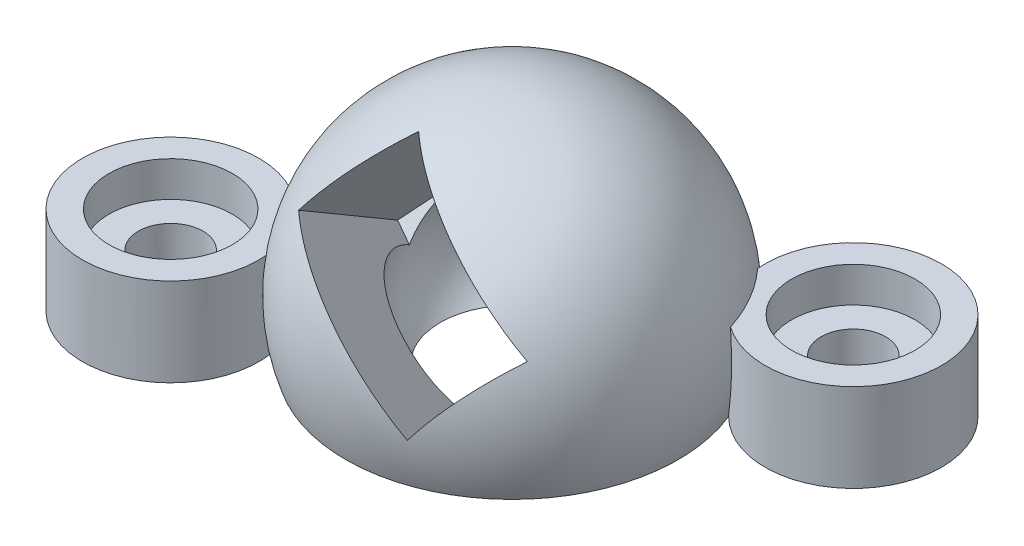
ISO-10303-21;
HEADER;
FILE_DESCRIPTION(('STEP AP214'),'2;1');
FILE_NAME('part.step','',(''),(''),'','','');
FILE_SCHEMA(('AUTOMOTIVE_DESIGN { 1 0 10303 214 1 1 1 1 }'));
ENDSEC;
DATA;
#1=APPLICATION_CONTEXT('core data for automotive mechanical design processes');
#2=APPLICATION_PROTOCOL_DEFINITION('international standard','automotive_design',2000,#1);
#3=PRODUCT_CONTEXT('',#1,'mechanical');
#4=PRODUCT('Part','Part','',(#3));
#5=PRODUCT_RELATED_PRODUCT_CATEGORY('part','',(#4));
#6=PRODUCT_DEFINITION_FORMATION('','',#4);
#7=PRODUCT_DEFINITION_CONTEXT('part definition',#1,'design');
#8=PRODUCT_DEFINITION('design','',#6,#7);
#9=PRODUCT_DEFINITION_SHAPE('','',#8);
#10=(LENGTH_UNIT() NAMED_UNIT(*) SI_UNIT(.MILLI.,.METRE.));
#11=(NAMED_UNIT(*) PLANE_ANGLE_UNIT() SI_UNIT($,.RADIAN.));
#12=(NAMED_UNIT(*) SI_UNIT($,.STERADIAN.) SOLID_ANGLE_UNIT());
#13=UNCERTAINTY_MEASURE_WITH_UNIT(LENGTH_MEASURE(1.E-05),#10,'distance_accuracy_value','');
#14=(GEOMETRIC_REPRESENTATION_CONTEXT(3) GLOBAL_UNCERTAINTY_ASSIGNED_CONTEXT((#13)) GLOBAL_UNIT_ASSIGNED_CONTEXT((#10,
#11,#12)) REPRESENTATION_CONTEXT('',''));
#15=CARTESIAN_POINT('',(0.,0.,0.));
#16=DIRECTION('',(0.,0.,1.));
#17=DIRECTION('',(1.,0.,0.));
#18=AXIS2_PLACEMENT_3D('',#15,#16,#17);
#19=CARTESIAN_POINT('',(-71.2916512459885,73.,-25.9807621135332));
#20=DIRECTION('',(0.,1.,0.));
#21=DIRECTION('',(0.5,0.,0.866025403784439));
#22=AXIS2_PLACEMENT_3D('',#19,#20,#21);
#23=SPHERICAL_SURFACE('',#22,5.99999999999999);
#24=CARTESIAN_POINT('',(-71.2916512459885,71.,-25.9807621135332));
#25=DIRECTION('',(0.,-1.,0.));
#26=DIRECTION('',(0.,0.,-1.));
#27=AXIS2_PLACEMENT_3D('',#24,#25,#26);
#28=CIRCLE('',#27,5.65685424949238);
#29=CARTESIAN_POINT('',(-76.5335077636322,71.,-23.8540415751369));
#30=VERTEX_POINT('',#29);
#31=CARTESIAN_POINT('',(-66.8289289741654,71.,-29.4569827516075));
#32=VERTEX_POINT('',#31);
#33=EDGE_CURVE('E237',#30,#32,#28,.T.);
#34=ORIENTED_EDGE('',*,*,#33,.F.);
#35=CARTESIAN_POINT('',(-76.9288621112924,74.0002,-24.1859212793364));
#36=CARTESIAN_POINT('',(-76.9404096114301,73.9496620404665,-24.1940265280293));
#37=CARTESIAN_POINT('',(-76.9510396694773,73.8988041487702,-24.2013730447985));
#38=CARTESIAN_POINT('',(-76.9704792720344,73.7965686087353,-24.2146527744234));
#39=CARTESIAN_POINT('',(-76.9792891798448,73.7451910662703,-24.2205862693533));
#40=CARTESIAN_POINT('',(-77.0030075724958,73.5904873630535,-24.236421748871));
#41=CARTESIAN_POINT('',(-77.0152178517531,73.4865322631475,-24.2443677264348));
#42=CARTESIAN_POINT('',(-77.032681173534,73.2757451332539,-24.2556591452825));
#43=CARTESIAN_POINT('',(-77.0377924095279,73.1688967733631,-24.2589108654573));
#44=CARTESIAN_POINT('',(-77.0406427281053,72.9550449188531,-24.2607295873572));
#45=CARTESIAN_POINT('',(-77.0383807974859,72.8480414049326,-24.259295945231));
#46=CARTESIAN_POINT('',(-77.0264789882416,72.6348501805666,-24.2516571619921));
#47=CARTESIAN_POINT('',(-77.0168554860158,72.52866118703,-24.2454626117526));
#48=CARTESIAN_POINT('',(-76.9901860137667,72.3176550384306,-24.2279101209463));
#49=CARTESIAN_POINT('',(-76.9731413656155,72.2128376424789,-24.2165530999151));
#50=CARTESIAN_POINT('',(-76.9317331083372,72.0065978326292,-24.1880624752238));
#51=CARTESIAN_POINT('',(-76.9074485787039,71.9051512731432,-24.1709910529886));
#52=CARTESIAN_POINT('',(-76.8513847973874,71.7058549967528,-24.129902290681));
#53=CARTESIAN_POINT('',(-76.8196121769803,71.6080021854261,-24.1058910920759));
#54=CARTESIAN_POINT('',(-76.7495424127959,71.4206435124871,-24.0500950992091));
#55=CARTESIAN_POINT('',(-76.7114866773368,71.3309707282417,-24.0185837436535));
#56=CARTESIAN_POINT('',(-76.6489292568986,71.2020077467898,-23.9634749391562));
#57=CARTESIAN_POINT('',(-76.6270691653911,71.1597920463395,-23.9437064995161));
#58=CARTESIAN_POINT('',(-76.58155328353,71.0778030739371,-23.9011582338771));
#59=CARTESIAN_POINT('',(-76.55789405521,71.0380347549418,-23.8783725774296));
#60=CARTESIAN_POINT('',(-76.5333795030156,70.9997999999986,-23.8539135435857));
#61=B_SPLINE_CURVE_WITH_KNOTS('',3,(#35,#36,#37,#38,#39,#40,#41,#42,#43,#44,#45,#46,#47,#48,#49,
#50,#51,#52,#53,#54,#55,#56,#57,#58,#59,#60),.UNSPECIFIED.,.F.,.F.,(4,2,2,2,2,2,2,2,2,2,2,2,4),
(0.,0.157377048485897,0.314722654217877,0.629234458382303,0.949942579700665,1.27069477382301,
1.5907354969119,1.91071923689573,2.22732850930363,2.54365844666381,2.84986255835412,
3.00416307873573,3.15876624238508),.UNSPECIFIED.);
#62=CARTESIAN_POINT('',(-76.9289078099031,74.,-24.1859533681225));
#63=VERTEX_POINT('',#62);
#64=EDGE_CURVE('E223',#63,#30,#61,.T.);
#65=ORIENTED_EDGE('',*,*,#64,.F.);
#66=CARTESIAN_POINT('',(-71.2916512459885,74.,-25.9807621135332));
#67=DIRECTION('',(0.,-1.,0.));
#68=DIRECTION('',(0.,0.,-1.));
#69=AXIS2_PLACEMENT_3D('',#66,#67,#68);
#70=CIRCLE('',#69,5.91607978309961);
#71=CARTESIAN_POINT('',(-75.6646294964059,74.,-21.9961590942379));
#72=VERTEX_POINT('',#71);
#73=EDGE_CURVE('E245',#63,#72,#70,.F.);
#74=ORIENTED_EDGE('',*,*,#73,.T.);
#75=CARTESIAN_POINT('',(-75.7544202660812,70.9998000000002,-22.5047165681897));
#76=CARTESIAN_POINT('',(-75.7478610713158,71.0278724460281,-22.480141831029));
#77=CARTESIAN_POINT('',(-75.741857082309,71.0567865660781,-22.4564149029977));
#78=CARTESIAN_POINT('',(-75.7308218750301,71.1160434934823,-22.4106215828581));
#79=CARTESIAN_POINT('',(-75.7257898790342,71.1463851342514,-22.3885538718634));
#80=CARTESIAN_POINT('',(-75.7119680996226,71.2389943886753,-22.3248986796105));
#81=CARTESIAN_POINT('',(-75.7044028245519,71.3030725103163,-22.2856652917006));
#82=CARTESIAN_POINT('',(-75.6917327364516,71.4339893832939,-22.2134726758537));
#83=CARTESIAN_POINT('',(-75.6866038828535,71.5007937830545,-22.1804541722372));
#84=CARTESIAN_POINT('',(-75.6780360064624,71.6369688871943,-22.1197574394365));
#85=CARTESIAN_POINT('',(-75.6745990667091,71.7063426425283,-22.0920858185161));
#86=CARTESIAN_POINT('',(-75.6680470503794,71.8687142272827,-22.0340006768176));
#87=CARTESIAN_POINT('',(-75.6653613066737,71.9623745047608,-22.0053920932579));
#88=CARTESIAN_POINT('',(-75.6612508589966,72.1518627703872,-21.9562299517404));
#89=CARTESIAN_POINT('',(-75.6598272078145,72.2476925000112,-21.9356831265414));
#90=CARTESIAN_POINT('',(-75.6577195968348,72.4413341169988,-21.9021519441187));
#91=CARTESIAN_POINT('',(-75.6570407221433,72.5391550423467,-21.8892198519956));
#92=CARTESIAN_POINT('',(-75.6561275724576,72.7354433347077,-21.8708876949954));
#93=CARTESIAN_POINT('',(-75.6558930572532,72.8339103235682,-21.8654835611013));
#94=CARTESIAN_POINT('',(-75.6557488701633,73.0229211548649,-21.8622287844167));
#95=CARTESIAN_POINT('',(-75.6558142405219,73.1134555342488,-21.863797479396));
#96=CARTESIAN_POINT('',(-75.6562479438936,73.294177518352,-21.8732152392726));
#97=CARTESIAN_POINT('',(-75.6566162051309,73.3843652001414,-21.8810628162579));
#98=CARTESIAN_POINT('',(-75.6577954010961,73.5629332316184,-21.9030314673953));
#99=CARTESIAN_POINT('',(-75.6586012267414,73.6513224558665,-21.9170797928769));
#100=CARTESIAN_POINT('',(-75.660970058192,73.8268475917444,-21.9516933011054));
#101=CARTESIAN_POINT('',(-75.6625334535248,73.9139828348421,-21.9722618345323));
#102=CARTESIAN_POINT('',(-75.6646344368045,74.0002,-21.9962147147887));
#103=B_SPLINE_CURVE_WITH_KNOTS('',3,(#75,#76,#77,#78,#79,#80,#81,#82,#83,#84,#85,#86,#87,#88,
#89,#90,#91,#92,#93,#94,#95,#96,#97,#98,#99,#100,#101,#102),.UNSPECIFIED.,.F.,.F.,(4,2,2,2,2,2,
2,2,2,2,2,2,2,4),(0.,0.113585797209057,0.227080330731909,0.453169231823033,0.67697839353544,
0.901062418300023,1.19454534747423,1.48827285917174,1.78399360635981,2.07955444826517,
2.35098507155577,2.62235139274873,2.89061526718655,3.15901722427214),.UNSPECIFIED.);
#104=CARTESIAN_POINT('',(-75.7543735178116,71.,-22.5045414754588));
#105=VERTEX_POINT('',#104);
#106=EDGE_CURVE('E233',#105,#72,#103,.T.);
#107=ORIENTED_EDGE('',*,*,#106,.F.);
#108=CARTESIAN_POINT('',(-66.0497947283448,71.,-28.1074826519294));
#109=VERTEX_POINT('',#108);
#110=EDGE_CURVE('E238',#109,#105,#28,.T.);
#111=ORIENTED_EDGE('',*,*,#110,.F.);
#112=CARTESIAN_POINT('',(-65.6544403806847,74.0002,-27.7756029477299));
#113=CARTESIAN_POINT('',(-65.642892880547,73.9496620404665,-27.7674976990371));
#114=CARTESIAN_POINT('',(-65.6322628224998,73.8988041487702,-27.7601511822679));
#115=CARTESIAN_POINT('',(-65.6128232199427,73.7965686087353,-27.746871452643));
#116=CARTESIAN_POINT('',(-65.6040133121323,73.7451910662704,-27.740937957713));
#117=CARTESIAN_POINT('',(-65.5802949194813,73.5904873630535,-27.7251024781954));
#118=CARTESIAN_POINT('',(-65.568084640224,73.4865322631475,-27.7171565006315));
#119=CARTESIAN_POINT('',(-65.550621318443,73.275745133254,-27.7058650817838));
#120=CARTESIAN_POINT('',(-65.5455100824492,73.1688967733632,-27.702613361609));
#121=CARTESIAN_POINT('',(-65.5426597638718,72.9550449188532,-27.7007946397091));
#122=CARTESIAN_POINT('',(-65.5449216944912,72.8480414049327,-27.7022282818354));
#123=CARTESIAN_POINT('',(-65.5568235037355,72.6348501805667,-27.7098670650743));
#124=CARTESIAN_POINT('',(-65.5664470059613,72.5286611870301,-27.7160616153137));
#125=CARTESIAN_POINT('',(-65.5931164782104,72.3176550384307,-27.73361410612));
#126=CARTESIAN_POINT('',(-65.6101611263616,72.212837642479,-27.7449711271512));
#127=CARTESIAN_POINT('',(-65.6515693836399,72.0065978326293,-27.7734617518426));
#128=CARTESIAN_POINT('',(-65.6758539132732,71.9051512731433,-27.7905331740777));
#129=CARTESIAN_POINT('',(-65.7319176945896,71.7058549967529,-27.8316219363854));
#130=CARTESIAN_POINT('',(-65.7636903149968,71.6080021854263,-27.8556331349905));
#131=CARTESIAN_POINT('',(-65.8337600791811,71.4206435124872,-27.9114291278573));
#132=CARTESIAN_POINT('',(-65.8718158146403,71.3309707282418,-27.9429404834129));
#133=CARTESIAN_POINT('',(-65.9343732350786,71.2020077467898,-27.9980492879102));
#134=CARTESIAN_POINT('',(-65.956233326586,71.1597920463395,-28.0178177275503));
#135=CARTESIAN_POINT('',(-66.0017492084471,71.0778030739371,-28.0603659931893));
#136=CARTESIAN_POINT('',(-66.0254084367672,71.0380347549418,-28.0831516496368));
#137=CARTESIAN_POINT('',(-66.0499229889615,70.9997999999986,-28.1076106834807));
#138=B_SPLINE_CURVE_WITH_KNOTS('',3,(#112,#113,#114,#115,#116,#117,#118,#119,#120,#121,#122,
#123,#124,#125,#126,#127,#128,#129,#130,#131,#132,#133,#134,#135,#136,#137),.UNSPECIFIED.,.F.,
.F.,(4,2,2,2,2,2,2,2,2,2,2,2,4),(0.,0.157377048485897,0.314722654217848,0.629234458382262,
0.949942579700582,1.27069477382293,1.59073549691181,1.91071923689562,2.22732850930349,
2.54365844666364,2.84986255835406,3.00416307873573,3.15876624238513),.UNSPECIFIED.);
#139=CARTESIAN_POINT('',(-65.654394682074,74.,-27.7755708589438));
#140=VERTEX_POINT('',#139);
#141=EDGE_CURVE('E190',#140,#109,#138,.T.);
#142=ORIENTED_EDGE('',*,*,#141,.F.);
#143=CARTESIAN_POINT('',(-71.2916512459885,74.,-25.9807621135332));
#144=DIRECTION('',(0.,-1.,0.));
#145=DIRECTION('',(0.,0.,-1.));
#146=AXIS2_PLACEMENT_3D('',#143,#144,#145);
#147=CIRCLE('',#146,5.91607978309961);
#148=CARTESIAN_POINT('',(-66.9186729955711,74.,-29.9653651328283));
#149=VERTEX_POINT('',#148);
#150=EDGE_CURVE('E244',#140,#149,#147,.F.);
#151=ORIENTED_EDGE('',*,*,#150,.T.);
#152=CARTESIAN_POINT('',(-66.8288822258958,70.9998000000002,-29.4568076588764));
#153=CARTESIAN_POINT('',(-66.8354414206612,71.0278724460281,-29.4813823960372));
#154=CARTESIAN_POINT('',(-66.841445409668,71.0567865660781,-29.5051093240685));
#155=CARTESIAN_POINT('',(-66.8524806169469,71.1160434934823,-29.550902644208));
#156=CARTESIAN_POINT('',(-66.8575126129428,71.1463851342514,-29.5729703552028));
#157=CARTESIAN_POINT('',(-66.8713343923544,71.2389943886752,-29.6366255474556));
#158=CARTESIAN_POINT('',(-66.8788996674251,71.3030725103162,-29.6758589353656));
#159=CARTESIAN_POINT('',(-66.8915697555255,71.4339893832938,-29.7480515512125));
#160=CARTESIAN_POINT('',(-66.8966986091235,71.5007937830544,-29.781070054829));
#161=CARTESIAN_POINT('',(-66.9052664855146,71.6369688871942,-29.8417667876296));
#162=CARTESIAN_POINT('',(-66.9087034252679,71.7063426425282,-29.8694384085501));
#163=CARTESIAN_POINT('',(-66.9152554415977,71.8687142272826,-29.9275235502486));
#164=CARTESIAN_POINT('',(-66.9179411853033,71.9623745047606,-29.9561321338083));
#165=CARTESIAN_POINT('',(-66.9220516329804,72.151862770387,-30.0052942753258));
#166=CARTESIAN_POINT('',(-66.9234752841625,72.2476925000111,-30.0258411005248));
#167=CARTESIAN_POINT('',(-66.9255828951422,72.4413341169986,-30.0593722829475));
#168=CARTESIAN_POINT('',(-66.9262617698337,72.5391550423465,-30.0723043750706));
#169=CARTESIAN_POINT('',(-66.9271749195194,72.7354433347075,-30.0906365320708));
#170=CARTESIAN_POINT('',(-66.9274094347238,72.8339103235679,-30.0960406659649));
#171=CARTESIAN_POINT('',(-66.9275536218137,73.0229211548647,-30.0992954426495));
#172=CARTESIAN_POINT('',(-66.9274882514551,73.1134555342486,-30.0977267476702));
#173=CARTESIAN_POINT('',(-66.9270545480834,73.2941775183518,-30.0883089877937));
#174=CARTESIAN_POINT('',(-66.9266862868461,73.3843652001413,-30.0804614108083));
#175=CARTESIAN_POINT('',(-66.925507090881,73.5629332316183,-30.058492759671));
#176=CARTESIAN_POINT('',(-66.9247012652356,73.6513224558665,-30.0444444341893));
#177=CARTESIAN_POINT('',(-66.922332433785,73.8268475917444,-30.0098309259609));
#178=CARTESIAN_POINT('',(-66.9207690384522,73.9139828348421,-29.9892623925339));
#179=CARTESIAN_POINT('',(-66.9186680551725,74.0002,-29.9653095122775));
#180=B_SPLINE_CURVE_WITH_KNOTS('',3,(#152,#153,#154,#155,#156,#157,#158,#159,#160,#161,#162,
#163,#164,#165,#166,#167,#168,#169,#170,#171,#172,#173,#174,#175,#176,#177,#178,#179),
.UNSPECIFIED.,.F.,.F.,(4,2,2,2,2,2,2,2,2,2,2,2,2,4),(0.,0.113585797209044,0.227080330731855,
0.453169231822974,0.676978393535343,0.901062418299918,1.19454534747411,1.48827285917158,
1.78399360635961,2.07955444826494,2.35098507155562,2.62235139274863,2.89061526718653,
3.15901722427217),.UNSPECIFIED.);
#181=EDGE_CURVE('E200',#32,#149,#180,.T.);
#182=ORIENTED_EDGE('',*,*,#181,.F.);
#183=EDGE_LOOP('',(#34,#65,#74,#107,#111,#142,#151,#182));
#184=FACE_BOUND('',#183,.T.);
#185=CARTESIAN_POINT('',(-72.3829899580333,71.7684504931306,-25.0308854753731));
#186=DIRECTION('',(-0.57438879581302,-0.648183950983877,0.499935072715847));
#187=DIRECTION('',(0.748425964464047,-0.663218346938669,0.));
#188=AXIS2_PLACEMENT_3D('',#185,#186,#187);
#189=CIRCLE('',#188,5.69122131005288);
#190=CARTESIAN_POINT('',(-74.4159921177242,76.0254293010476,-21.847328714824));
#191=VERTEX_POINT('',#190);
#192=CARTESIAN_POINT('',(-69.2324587112696,72.5784404179814,-20.3609744285965));
#193=VERTEX_POINT('',#192);
#194=EDGE_CURVE('E161',#191,#193,#189,.F.);
#195=ORIENTED_EDGE('',*,*,#194,.F.);
#196=CARTESIAN_POINT('',(-73.8834179492158,74.7234944415331,-26.7239392566469));
#197=DIRECTION('',(-0.80992709475853,0.538592012979103,-0.232242857223047));
#198=DIRECTION('',(-0.55373225411861,-0.832694776462975,0.));
#199=AXIS2_PLACEMENT_3D('',#196,#197,#198);
#200=CIRCLE('',#199,5.07543101617981);
#201=CARTESIAN_POINT('',(-72.2333146936347,78.4885283147864,-23.7470819911442));
#202=VERTEX_POINT('',#201);
#203=EDGE_CURVE('E11',#202,#191,#200,.F.);
#204=ORIENTED_EDGE('',*,*,#203,.F.);
#205=CARTESIAN_POINT('',(-70.2003125339438,74.2315495068694,-26.9306387516933));
#206=DIRECTION('',(0.574388795813023,0.648183950983875,-0.499935072715846));
#207=DIRECTION('',(-0.748425964464045,0.663218346938672,0.));
#208=AXIS2_PLACEMENT_3D('',#205,#206,#207);
#209=CIRCLE('',#208,5.69122131005286);
#210=CARTESIAN_POINT('',(-67.0497812871801,75.0415394317201,-22.2607277049167));
#211=VERTEX_POINT('',#210);
#212=EDGE_CURVE('E158',#211,#202,#209,.F.);
#213=ORIENTED_EDGE('',*,*,#212,.F.);
#214=CARTESIAN_POINT('',(-68.6998845427612,71.2765055584669,-25.2375849704194));
#215=DIRECTION('',(0.809927094758531,-0.538592012979103,0.232242857223047));
#216=DIRECTION('',(0.553732254118609,0.832694776462975,0.));
#217=AXIS2_PLACEMENT_3D('',#214,#215,#216);
#218=CIRCLE('',#217,5.07543101617979);
#219=EDGE_CURVE('E164',#193,#211,#218,.F.);
#220=ORIENTED_EDGE('',*,*,#219,.F.);
#221=EDGE_LOOP('',(#195,#204,#213,#220));
#222=FACE_BOUND('',#221,.T.);
#223=ADVANCED_FACE('F41',(#184,#222),#23,.T.);
#224=CARTESIAN_POINT('',(-74.1200783707347,71.,-30.8797415990995));
#225=DIRECTION('',(0.,-1.,0.));
#226=DIRECTION('',(0.,0.,1.));
#227=AXIS2_PLACEMENT_3D('',#224,#225,#226);
#228=PLANE('',#227);
#229=CARTESIAN_POINT('',(-63.9304353138208,71.,-30.2307621135332));
#230=DIRECTION('',(0.,1.,0.));
#231=DIRECTION('',(0.,0.,1.));
#232=AXIS2_PLACEMENT_3D('',#229,#230,#231);
#233=CIRCLE('',#232,1.1);
#234=CARTESIAN_POINT('',(-63.9304353138208,71.,-29.1307621135332));
#235=VERTEX_POINT('',#234);
#236=EDGE_CURVE('E175',#235,#235,#233,.F.);
#237=ORIENTED_EDGE('',*,*,#236,.F.);
#238=EDGE_LOOP('',(#237));
#239=FACE_BOUND('',#238,.T.);
#240=CARTESIAN_POINT('',(-78.6528671781562,71.,-21.7307621135332));
#241=DIRECTION('',(0.,1.,0.));
#242=DIRECTION('',(0.,0.,1.));
#243=AXIS2_PLACEMENT_3D('',#240,#241,#242);
#244=CIRCLE('',#243,1.1);
#245=CARTESIAN_POINT('',(-78.6528671781562,71.,-20.6307621135332));
#246=VERTEX_POINT('',#245);
#247=EDGE_CURVE('E179',#246,#246,#244,.F.);
#248=ORIENTED_EDGE('',*,*,#247,.F.);
#249=EDGE_LOOP('',(#248));
#250=FACE_BOUND('',#249,.T.);
#251=ORIENTED_EDGE('',*,*,#110,.T.);
#252=CARTESIAN_POINT('',(-78.6528671781562,71.,-21.7307621135332));
#253=DIRECTION('',(0.,-1.,0.));
#254=DIRECTION('',(0.,0.,-1.));
#255=AXIS2_PLACEMENT_3D('',#252,#253,#254);
#256=CIRCLE('',#255,3.);
#257=EDGE_CURVE('E299',#105,#30,#256,.T.);
#258=ORIENTED_EDGE('',*,*,#257,.T.);
#259=ORIENTED_EDGE('',*,*,#33,.T.);
#260=CARTESIAN_POINT('',(-63.9304353138208,71.,-30.2307621135332));
#261=DIRECTION('',(0.,-1.,0.));
#262=DIRECTION('',(0.,0.,-1.));
#263=AXIS2_PLACEMENT_3D('',#260,#261,#262);
#264=CIRCLE('',#263,3.);
#265=EDGE_CURVE('E189',#32,#109,#264,.T.);
#266=ORIENTED_EDGE('',*,*,#265,.T.);
#267=EDGE_LOOP('',(#251,#258,#259,#266));
#268=FACE_BOUND('',#267,.T.);
#269=DIRECTION('',(-0.275637355817001,0.,0.961261695938318));
#270=VECTOR('',#269,1.);
#271=CARTESIAN_POINT('',(-67.7866482126503,71.,-29.0636597252431));
#272=LINE('',#271,#270);
#273=CARTESIAN_POINT('',(-68.9449101940788,71.,-25.0243201614579));
#274=VERTEX_POINT('',#273);
#275=CARTESIAN_POINT('',(-69.5805865905474,71.,-22.8074531148044));
#276=VERTEX_POINT('',#275);
#277=EDGE_CURVE('E47',#274,#276,#272,.T.);
#278=ORIENTED_EDGE('',*,*,#277,.F.);
#279=DIRECTION('',(0.990026908932881,0.,-0.140878385811326));
#280=VECTOR('',#279,1.);
#281=CARTESIAN_POINT('',(-73.2006927646904,71.,-24.418732804688));
#282=LINE('',#281,#280);
#283=CARTESIAN_POINT('',(-69.0609900978729,71.,-25.0078022776265));
#284=VERTEX_POINT('',#283);
#285=EDGE_CURVE('E160',#284,#274,#282,.T.);
#286=ORIENTED_EDGE('',*,*,#285,.F.);
#287=CARTESIAN_POINT('',(-71.2916512459885,71.,-25.9807621135332));
#288=DIRECTION('',(0.,1.,0.));
#289=DIRECTION('',(0.,0.,1.));
#290=AXIS2_PLACEMENT_3D('',#287,#288,#289);
#291=CIRCLE('',#290,2.4336187047276);
#292=CARTESIAN_POINT('',(-70.3789893275757,71.,-23.7247594046077));
#293=VERTEX_POINT('',#292);
#294=EDGE_CURVE('E182',#284,#293,#291,.T.);
#295=ORIENTED_EDGE('',*,*,#294,.T.);
#296=DIRECTION('',(-0.656527529381849,0.,-0.754302063608317));
#297=VECTOR('',#296,1.);
#298=CARTESIAN_POINT('',(-75.5347957251093,71.,-29.6484034730998));
#299=LINE('',#298,#297);
#300=EDGE_CURVE('E163',#276,#293,#299,.T.);
#301=ORIENTED_EDGE('',*,*,#300,.F.);
#302=EDGE_LOOP('',(#278,#286,#295,#301));
#303=FACE_BOUND('',#302,.T.);
#304=ADVANCED_FACE('F221',(#239,#250,#268,#303),#228,.T.);
#305=CARTESIAN_POINT('',(-71.2916512459885,73.,-25.9807621135332));
#306=DIRECTION('',(-0.866025403784439,0.,0.5));
#307=DIRECTION('',(-0.5,0.,-0.866025403784439));
#308=AXIS2_PLACEMENT_3D('',#305,#306,#307);
#309=SPHERICAL_SURFACE('',#308,3.15);
#310=CARTESIAN_POINT('',(-72.3829899580333,71.7684504931306,-25.0308854753731));
#311=DIRECTION('',(-0.57438879581302,-0.648183950983877,0.499935072715847));
#312=DIRECTION('',(0.748425964464047,-0.663218346938669,0.));
#313=AXIS2_PLACEMENT_3D('',#310,#311,#312);
#314=CIRCLE('',#313,2.51246890528022);
#315=CARTESIAN_POINT('',(-74.417906599158,73.1216461783729,-25.6143884326193));
#316=VERTEX_POINT('',#315);
#317=EDGE_CURVE('E137',#316,#293,#314,.F.);
#318=ORIENTED_EDGE('',*,*,#317,.T.);
#319=ORIENTED_EDGE('',*,*,#294,.F.);
#320=CARTESIAN_POINT('',(-71.2916512459885,73.,-25.9807621135331));
#321=DIRECTION('',(-0.118724944390263,-0.538308656109163,-0.834342962059054));
#322=DIRECTION('',(0.,0.840286153588461,-0.542143136161945));
#323=AXIS2_PLACEMENT_3D('',#320,#321,#322);
#324=CIRCLE('',#323,3.15);
#325=CARTESIAN_POINT('',(-68.165395892819,72.8783538216271,-26.3471357944469));
#326=VERTEX_POINT('',#325);
#327=EDGE_CURVE('E64',#284,#326,#324,.F.);
#328=ORIENTED_EDGE('',*,*,#327,.T.);
#329=CARTESIAN_POINT('',(-70.2003125339438,74.2315495068694,-26.9306387516933));
#330=DIRECTION('',(0.574388795813023,0.648183950983875,-0.499935072715846));
#331=DIRECTION('',(-0.748425964464045,0.663218346938672,0.));
#332=AXIS2_PLACEMENT_3D('',#329,#330,#331);
#333=CIRCLE('',#332,2.51246890528021);
#334=CARTESIAN_POINT('',(-72.2352291750685,75.5847451921117,-27.5141417089396));
#335=VERTEX_POINT('',#334);
#336=EDGE_CURVE('E256',#326,#335,#333,.F.);
#337=ORIENTED_EDGE('',*,*,#336,.T.);
#338=EDGE_CURVE('E258',#335,#316,#324,.F.);
#339=ORIENTED_EDGE('',*,*,#338,.T.);
#340=EDGE_LOOP('',(#318,#319,#328,#337,#339));
#341=FACE_BOUND('',#340,.T.);
#342=ADVANCED_FACE('F289',(#341),#309,.F.);
#343=CARTESIAN_POINT('',(-63.9304353138208,74.25,-30.2307621135332));
#344=DIRECTION('',(0.,-1.,0.));
#345=DIRECTION('',(0.,0.,1.));
#346=AXIS2_PLACEMENT_3D('',#343,#344,#345);
#347=CYLINDRICAL_SURFACE('',#346,1.1);
#348=ORIENTED_EDGE('',*,*,#236,.T.);
#349=EDGE_LOOP('',(#348));
#350=FACE_BOUND('',#349,.T.);
#351=CARTESIAN_POINT('',(-63.9304353138208,72.8,-30.2307621135332));
#352=DIRECTION('',(0.,-1.,0.));
#353=DIRECTION('',(0.,0.,-1.));
#354=AXIS2_PLACEMENT_3D('',#351,#352,#353);
#355=CIRCLE('',#354,1.1);
#356=CARTESIAN_POINT('',(-63.9304353138208,72.8,-31.3307621135332));
#357=VERTEX_POINT('',#356);
#358=EDGE_CURVE('E171',#357,#357,#355,.T.);
#359=ORIENTED_EDGE('',*,*,#358,.F.);
#360=EDGE_LOOP('',(#359));
#361=FACE_BOUND('',#360,.T.);
#362=ADVANCED_FACE('F334',(#350,#361),#347,.F.);
#363=CARTESIAN_POINT('',(-78.6528671781562,74.25,-21.7307621135332));
#364=DIRECTION('',(0.,-1.,0.));
#365=DIRECTION('',(0.,0.,1.));
#366=AXIS2_PLACEMENT_3D('',#363,#364,#365);
#367=CYLINDRICAL_SURFACE('',#366,1.1);
#368=ORIENTED_EDGE('',*,*,#247,.T.);
#369=EDGE_LOOP('',(#368));
#370=FACE_BOUND('',#369,.T.);
#371=CARTESIAN_POINT('',(-78.6528671781562,72.8,-21.7307621135332));
#372=DIRECTION('',(0.,-1.,0.));
#373=DIRECTION('',(0.,0.,-1.));
#374=AXIS2_PLACEMENT_3D('',#371,#372,#373);
#375=CIRCLE('',#374,1.1);
#376=CARTESIAN_POINT('',(-78.6528671781562,72.8,-22.8307621135332));
#377=VERTEX_POINT('',#376);
#378=EDGE_CURVE('E177',#377,#377,#375,.T.);
#379=ORIENTED_EDGE('',*,*,#378,.F.);
#380=EDGE_LOOP('',(#379));
#381=FACE_BOUND('',#380,.T.);
#382=ADVANCED_FACE('F217',(#370,#381),#367,.F.);
#383=CARTESIAN_POINT('',(-78.6528671781562,74.,-21.7307621135332));
#384=DIRECTION('',(0.,-1.,0.));
#385=DIRECTION('',(0.,0.,1.));
#386=AXIS2_PLACEMENT_3D('',#383,#384,#385);
#387=CYLINDRICAL_SURFACE('',#386,3.);
#388=ORIENTED_EDGE('',*,*,#106,.T.);
#389=CARTESIAN_POINT('',(-78.6528671781562,74.,-21.7307621135332));
#390=DIRECTION('',(0.,-1.,0.));
#391=DIRECTION('',(0.,0.,-1.));
#392=AXIS2_PLACEMENT_3D('',#389,#390,#391);
#393=CIRCLE('',#392,3.);
#394=EDGE_CURVE('E305',#72,#63,#393,.T.);
#395=ORIENTED_EDGE('',*,*,#394,.T.);
#396=ORIENTED_EDGE('',*,*,#64,.T.);
#397=ORIENTED_EDGE('',*,*,#257,.F.);
#398=EDGE_LOOP('',(#388,#395,#396,#397));
#399=FACE_BOUND('',#398,.T.);
#400=ADVANCED_FACE('F213',(#399),#387,.T.);
#401=CARTESIAN_POINT('',(-78.6528671781562,74.,-21.7307621135332));
#402=DIRECTION('',(0.,1.,0.));
#403=DIRECTION('',(0.,0.,-1.));
#404=AXIS2_PLACEMENT_3D('',#401,#402,#403);
#405=PLANE('',#404);
#406=CARTESIAN_POINT('',(-78.6528671781562,74.,-21.7307621135332));
#407=DIRECTION('',(0.,-1.,0.));
#408=DIRECTION('',(0.,0.,-1.));
#409=AXIS2_PLACEMENT_3D('',#406,#407,#408);
#410=CIRCLE('',#409,2.1);
#411=CARTESIAN_POINT('',(-78.6528671781562,74.,-23.8307621135332));
#412=VERTEX_POINT('',#411);
#413=EDGE_CURVE('E183',#412,#412,#410,.F.);
#414=ORIENTED_EDGE('',*,*,#413,.F.);
#415=EDGE_LOOP('',(#414));
#416=FACE_BOUND('',#415,.T.);
#417=ORIENTED_EDGE('',*,*,#394,.F.);
#418=ORIENTED_EDGE('',*,*,#73,.F.);
#419=EDGE_LOOP('',(#417,#418));
#420=FACE_BOUND('',#419,.T.);
#421=ADVANCED_FACE('F209',(#416,#420),#405,.T.);
#422=CARTESIAN_POINT('',(-63.9304353138208,74.,-30.2307621135332));
#423=DIRECTION('',(0.,-1.,0.));
#424=DIRECTION('',(0.,0.,1.));
#425=AXIS2_PLACEMENT_3D('',#422,#423,#424);
#426=CYLINDRICAL_SURFACE('',#425,3.);
#427=ORIENTED_EDGE('',*,*,#181,.T.);
#428=CARTESIAN_POINT('',(-63.9304353138208,74.,-30.2307621135332));
#429=DIRECTION('',(0.,-1.,0.));
#430=DIRECTION('',(0.,0.,-1.));
#431=AXIS2_PLACEMENT_3D('',#428,#429,#430);
#432=CIRCLE('',#431,3.);
#433=EDGE_CURVE('E184',#149,#140,#432,.T.);
#434=ORIENTED_EDGE('',*,*,#433,.T.);
#435=ORIENTED_EDGE('',*,*,#141,.T.);
#436=ORIENTED_EDGE('',*,*,#265,.F.);
#437=EDGE_LOOP('',(#427,#434,#435,#436));
#438=FACE_BOUND('',#437,.T.);
#439=ADVANCED_FACE('F202',(#438),#426,.T.);
#440=CARTESIAN_POINT('',(-63.9304353138208,74.,-30.2307621135332));
#441=DIRECTION('',(0.,1.,0.));
#442=DIRECTION('',(0.,0.,-1.));
#443=AXIS2_PLACEMENT_3D('',#440,#441,#442);
#444=PLANE('',#443);
#445=CARTESIAN_POINT('',(-63.9304353138208,74.,-30.2307621135332));
#446=DIRECTION('',(0.,-1.,0.));
#447=DIRECTION('',(0.,0.,-1.));
#448=AXIS2_PLACEMENT_3D('',#445,#446,#447);
#449=CIRCLE('',#448,2.1);
#450=CARTESIAN_POINT('',(-63.9304353138208,74.,-32.3307621135332));
#451=VERTEX_POINT('',#450);
#452=EDGE_CURVE('E176',#451,#451,#449,.F.);
#453=ORIENTED_EDGE('',*,*,#452,.F.);
#454=EDGE_LOOP('',(#453));
#455=FACE_BOUND('',#454,.T.);
#456=ORIENTED_EDGE('',*,*,#433,.F.);
#457=ORIENTED_EDGE('',*,*,#150,.F.);
#458=EDGE_LOOP('',(#456,#457));
#459=FACE_BOUND('',#458,.T.);
#460=ADVANCED_FACE('F206',(#455,#459),#444,.T.);
#461=CARTESIAN_POINT('',(-78.6528671781562,74.25,-21.7307621135332));
#462=DIRECTION('',(0.,-1.,0.));
#463=DIRECTION('',(0.,0.,1.));
#464=AXIS2_PLACEMENT_3D('',#461,#462,#463);
#465=CYLINDRICAL_SURFACE('',#464,2.1);
#466=ORIENTED_EDGE('',*,*,#413,.T.);
#467=EDGE_LOOP('',(#466));
#468=FACE_BOUND('',#467,.T.);
#469=CARTESIAN_POINT('',(-78.6528671781562,72.8,-21.7307621135332));
#470=DIRECTION('',(0.,-1.,0.));
#471=DIRECTION('',(0.,0.,-1.));
#472=AXIS2_PLACEMENT_3D('',#469,#470,#471);
#473=CIRCLE('',#472,2.1);
#474=CARTESIAN_POINT('',(-78.6528671781562,72.8,-23.8307621135332));
#475=VERTEX_POINT('',#474);
#476=EDGE_CURVE('E174',#475,#475,#473,.T.);
#477=ORIENTED_EDGE('',*,*,#476,.T.);
#478=EDGE_LOOP('',(#477));
#479=FACE_BOUND('',#478,.T.);
#480=ADVANCED_FACE('F307',(#468,#479),#465,.F.);
#481=CARTESIAN_POINT('',(-78.6528671781562,72.8,-21.7307621135332));
#482=DIRECTION('',(0.,1.,0.));
#483=DIRECTION('',(0.,0.,-1.));
#484=AXIS2_PLACEMENT_3D('',#481,#482,#483);
#485=PLANE('',#484);
#486=ORIENTED_EDGE('',*,*,#378,.T.);
#487=EDGE_LOOP('',(#486));
#488=FACE_BOUND('',#487,.T.);
#489=ORIENTED_EDGE('',*,*,#476,.F.);
#490=EDGE_LOOP('',(#489));
#491=FACE_BOUND('',#490,.T.);
#492=ADVANCED_FACE('F313',(#488,#491),#485,.T.);
#493=CARTESIAN_POINT('',(-63.9304353138208,74.25,-30.2307621135332));
#494=DIRECTION('',(0.,-1.,0.));
#495=DIRECTION('',(0.,0.,1.));
#496=AXIS2_PLACEMENT_3D('',#493,#494,#495);
#497=CYLINDRICAL_SURFACE('',#496,2.1);
#498=ORIENTED_EDGE('',*,*,#452,.T.);
#499=EDGE_LOOP('',(#498));
#500=FACE_BOUND('',#499,.T.);
#501=CARTESIAN_POINT('',(-63.9304353138208,72.8,-30.2307621135332));
#502=DIRECTION('',(0.,-1.,0.));
#503=DIRECTION('',(0.,0.,-1.));
#504=AXIS2_PLACEMENT_3D('',#501,#502,#503);
#505=CIRCLE('',#504,2.1);
#506=CARTESIAN_POINT('',(-63.9304353138208,72.8,-32.3307621135332));
#507=VERTEX_POINT('',#506);
#508=EDGE_CURVE('E166',#507,#507,#505,.T.);
#509=ORIENTED_EDGE('',*,*,#508,.T.);
#510=EDGE_LOOP('',(#509));
#511=FACE_BOUND('',#510,.T.);
#512=ADVANCED_FACE('F316',(#500,#511),#497,.F.);
#513=CARTESIAN_POINT('',(-63.9304353138208,72.8,-30.2307621135332));
#514=DIRECTION('',(0.,1.,0.));
#515=DIRECTION('',(0.,0.,-1.));
#516=AXIS2_PLACEMENT_3D('',#513,#514,#515);
#517=PLANE('',#516);
#518=ORIENTED_EDGE('',*,*,#358,.T.);
#519=EDGE_LOOP('',(#518));
#520=FACE_BOUND('',#519,.T.);
#521=ORIENTED_EDGE('',*,*,#508,.F.);
#522=EDGE_LOOP('',(#521));
#523=FACE_BOUND('',#522,.T.);
#524=ADVANCED_FACE('F325',(#520,#523),#517,.T.);
#525=CARTESIAN_POINT('',(-71.6048297932684,81.3381305094941,-19.3303862742164));
#526=DIRECTION('',(-0.574388795813023,-0.648183950983875,0.499935072715846));
#527=DIRECTION('',(-0.748425964464045,0.663218346938672,0.));
#528=AXIS2_PLACEMENT_3D('',#525,#526,#527);
#529=PLANE('',#528);
#530=DIRECTION('',(-0.118724944390263,-0.538308656109162,-0.834342962059055));
#531=VECTOR('',#530,1.);
#532=CARTESIAN_POINT('',(-66.4212963868138,77.8911416264279,-17.8440319879889));
#533=LINE('',#532,#531);
#534=CARTESIAN_POINT('',(-67.6085458307165,72.5080550653363,-26.1874616085795));
#535=VERTEX_POINT('',#534);
#536=EDGE_CURVE('E155',#211,#535,#533,.T.);
#537=ORIENTED_EDGE('',*,*,#536,.F.);
#538=ORIENTED_EDGE('',*,*,#212,.T.);
#539=DIRECTION('',(-0.118724944390263,-0.538308656109162,-0.834342962059055));
#540=VECTOR('',#539,1.);
#541=CARTESIAN_POINT('',(-71.6048297932684,81.3381305094941,-19.3303862742164));
#542=LINE('',#541,#540);
#543=CARTESIAN_POINT('',(-72.7920792371711,75.9550439484025,-27.673815894807));
#544=VERTEX_POINT('',#543);
#545=EDGE_CURVE('E54',#202,#544,#542,.T.);
#546=ORIENTED_EDGE('',*,*,#545,.T.);
#547=DIRECTION('',(0.809927094758531,-0.538592012979102,0.232242857223047));
#548=VECTOR('',#547,1.);
#549=CARTESIAN_POINT('',(-72.7920792371711,75.9550439484025,-27.673815894807));
#550=LINE('',#549,#548);
#551=EDGE_CURVE('E143',#544,#335,#550,.T.);
#552=ORIENTED_EDGE('',*,*,#551,.T.);
#553=ORIENTED_EDGE('',*,*,#336,.F.);
#554=EDGE_CURVE('E147',#326,#535,#550,.T.);
#555=ORIENTED_EDGE('',*,*,#554,.T.);
#556=EDGE_LOOP('',(#537,#538,#546,#552,#553,#555));
#557=FACE_BOUND('',#556,.T.);
#558=ADVANCED_FACE('F274',(#557),#529,.T.);
#559=CARTESIAN_POINT('',(1.08699436671566,4.928521800958,7.63888418162468));
#560=DIRECTION('',(0.118724944390263,0.538308656109163,0.834342962059054));
#561=DIRECTION('',(0.,0.840286153588461,-0.542143136161945));
#562=AXIS2_PLACEMENT_3D('',#559,#560,#561);
#563=PLANE('',#562);
#564=ORIENTED_EDGE('',*,*,#338,.F.);
#565=ORIENTED_EDGE('',*,*,#551,.F.);
#566=DIRECTION('',(0.574388795813024,0.648183950983875,-0.499935072715846));
#567=VECTOR('',#566,1.);
#568=CARTESIAN_POINT('',(-74.9747566612606,73.4919449346638,-25.7740626184868));
#569=LINE('',#568,#567);
#570=CARTESIAN_POINT('',(-74.9747566612606,73.4919449346638,-25.7740626184868));
#571=VERTEX_POINT('',#570);
#572=EDGE_CURVE('E127',#571,#544,#569,.T.);
#573=ORIENTED_EDGE('',*,*,#572,.F.);
#574=DIRECTION('',(-0.809927094758533,0.538592012979099,-0.232242857223046));
#575=VECTOR('',#574,1.);
#576=CARTESIAN_POINT('',(-69.791223254806,70.0449560515976,-24.2877083322593));
#577=LINE('',#576,#575);
#578=EDGE_CURVE('E134',#316,#571,#577,.T.);
#579=ORIENTED_EDGE('',*,*,#578,.F.);
#580=EDGE_LOOP('',(#564,#565,#573,#579));
#581=FACE_BOUND('',#580,.T.);
#582=ADVANCED_FACE('F144',(#581),#563,.T.);
#583=CARTESIAN_POINT('',(-66.4212963868138,77.8911416264279,-17.8440319879889));
#584=DIRECTION('',(-0.809927094758531,0.538592012979103,-0.232242857223047));
#585=DIRECTION('',(0.553732254118609,0.832694776462975,0.));
#586=AXIS2_PLACEMENT_3D('',#583,#584,#585);
#587=PLANE('',#586);
#588=DIRECTION('',(-0.118724944390263,-0.538308656109162,-0.834342962059055));
#589=VECTOR('',#588,1.);
#590=CARTESIAN_POINT('',(-68.6039738109033,75.4280426126892,-15.9442787116687));
#591=LINE('',#590,#589);
#592=EDGE_CURVE('E135',#193,#276,#591,.T.);
#593=ORIENTED_EDGE('',*,*,#592,.F.);
#594=ORIENTED_EDGE('',*,*,#219,.T.);
#595=ORIENTED_EDGE('',*,*,#536,.T.);
#596=DIRECTION('',(-0.574388795813023,-0.648183950983875,0.499935072715847));
#597=VECTOR('',#596,1.);
#598=CARTESIAN_POINT('',(-67.6085458307165,72.5080550653363,-26.1874616085795));
#599=LINE('',#598,#597);
#600=EDGE_CURVE('E145',#535,#274,#599,.T.);
#601=ORIENTED_EDGE('',*,*,#600,.T.);
#602=ORIENTED_EDGE('',*,*,#277,.T.);
#603=EDGE_LOOP('',(#593,#594,#595,#601,#602));
#604=FACE_BOUND('',#603,.T.);
#605=ADVANCED_FACE('F266',(#604),#587,.T.);
#606=CARTESIAN_POINT('',(-68.6039738109033,75.4280426126892,-15.9442787116687));
#607=DIRECTION('',(0.57438879581302,0.648183950983877,-0.499935072715847));
#608=DIRECTION('',(0.748425964464047,-0.663218346938669,0.));
#609=AXIS2_PLACEMENT_3D('',#606,#607,#608);
#610=PLANE('',#609);
#611=DIRECTION('',(-0.118724944390263,-0.538308656109162,-0.834342962059055));
#612=VECTOR('',#611,1.);
#613=CARTESIAN_POINT('',(-73.7875072173579,78.8750314957554,-17.4306329978962));
#614=LINE('',#613,#612);
#615=EDGE_CURVE('E125',#191,#571,#614,.T.);
#616=ORIENTED_EDGE('',*,*,#615,.F.);
#617=ORIENTED_EDGE('',*,*,#194,.T.);
#618=ORIENTED_EDGE('',*,*,#592,.T.);
#619=ORIENTED_EDGE('',*,*,#300,.T.);
#620=ORIENTED_EDGE('',*,*,#317,.F.);
#621=ORIENTED_EDGE('',*,*,#578,.T.);
#622=EDGE_LOOP('',(#616,#617,#618,#619,#620,#621));
#623=FACE_BOUND('',#622,.T.);
#624=ADVANCED_FACE('F136',(#623),#610,.T.);
#625=CARTESIAN_POINT('',(-73.7875072173579,78.8750314957554,-17.4306329978962));
#626=DIRECTION('',(0.80992709475853,-0.538592012979103,0.232242857223047));
#627=DIRECTION('',(-0.55373225411861,-0.832694776462975,0.));
#628=AXIS2_PLACEMENT_3D('',#625,#626,#627);
#629=PLANE('',#628);
#630=ORIENTED_EDGE('',*,*,#545,.F.);
#631=ORIENTED_EDGE('',*,*,#203,.T.);
#632=ORIENTED_EDGE('',*,*,#615,.T.);
#633=ORIENTED_EDGE('',*,*,#572,.T.);
#634=EDGE_LOOP('',(#630,#631,#632,#633));
#635=FACE_BOUND('',#634,.T.);
#636=ADVANCED_FACE('F121',(#635),#629,.T.);
#637=ORIENTED_EDGE('',*,*,#327,.F.);
#638=ORIENTED_EDGE('',*,*,#285,.T.);
#639=ORIENTED_EDGE('',*,*,#600,.F.);
#640=ORIENTED_EDGE('',*,*,#554,.F.);
#641=EDGE_LOOP('',(#637,#638,#639,#640));
#642=FACE_BOUND('',#641,.T.);
#643=ADVANCED_FACE('F277',(#642),#563,.T.);
#644=CLOSED_SHELL('',(#223,#304,#342,#362,#382,#400,#421,#439,#460,#480,#492,#512,#524,#558,
#582,#605,#624,#636,#643));
#645=MANIFOLD_SOLID_BREP('B2',#644);
#646=ADVANCED_BREP_SHAPE_REPRESENTATION('',(#18,#645),#14);
#647=SHAPE_DEFINITION_REPRESENTATION(#9,#646);
ENDSEC;
END-ISO-10303-21;
